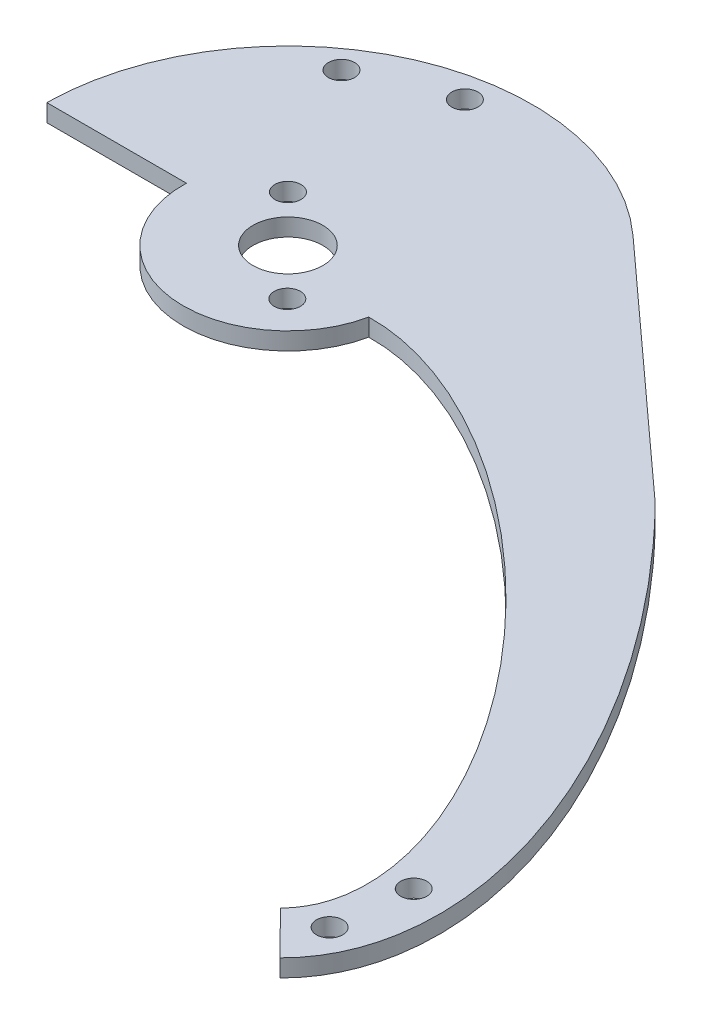
ISO-10303-21;
HEADER;
FILE_DESCRIPTION(('STEP AP214'),'2;1');
FILE_NAME('part.step','',(''),(''),'','','');
FILE_SCHEMA(('AUTOMOTIVE_DESIGN { 1 0 10303 214 1 1 1 1 }'));
ENDSEC;
DATA;
#1=APPLICATION_CONTEXT('core data for automotive mechanical design processes');
#2=APPLICATION_PROTOCOL_DEFINITION('international standard','automotive_design',2000,#1);
#3=PRODUCT_CONTEXT('',#1,'mechanical');
#4=PRODUCT('Part','Part','',(#3));
#5=PRODUCT_RELATED_PRODUCT_CATEGORY('part','',(#4));
#6=PRODUCT_DEFINITION_FORMATION('','',#4);
#7=PRODUCT_DEFINITION_CONTEXT('part definition',#1,'design');
#8=PRODUCT_DEFINITION('design','',#6,#7);
#9=PRODUCT_DEFINITION_SHAPE('','',#8);
#10=(LENGTH_UNIT() NAMED_UNIT(*) SI_UNIT(.MILLI.,.METRE.));
#11=(NAMED_UNIT(*) PLANE_ANGLE_UNIT() SI_UNIT($,.RADIAN.));
#12=(NAMED_UNIT(*) SI_UNIT($,.STERADIAN.) SOLID_ANGLE_UNIT());
#13=UNCERTAINTY_MEASURE_WITH_UNIT(LENGTH_MEASURE(1.E-05),#10,'distance_accuracy_value','');
#14=(GEOMETRIC_REPRESENTATION_CONTEXT(3) GLOBAL_UNCERTAINTY_ASSIGNED_CONTEXT((#13)) GLOBAL_UNIT_ASSIGNED_CONTEXT((#10,
#11,#12)) REPRESENTATION_CONTEXT('',''));
#15=CARTESIAN_POINT('',(0.,0.,0.));
#16=DIRECTION('',(0.,0.,1.));
#17=DIRECTION('',(1.,0.,0.));
#18=AXIS2_PLACEMENT_3D('',#15,#16,#17);
#19=CARTESIAN_POINT('',(35.1255795593791,2.,35.5836150583064));
#20=DIRECTION('',(0.,1.,0.));
#21=DIRECTION('',(0.,0.,1.));
#22=AXIS2_PLACEMENT_3D('',#19,#20,#21);
#23=PLANE('',#22);
#24=CARTESIAN_POINT('',(-14.3394109087762,2.,-20.4788011072248));
#25=DIRECTION('',(0.,1.,0.));
#26=DIRECTION('',(0.,0.,-1.));
#27=AXIS2_PLACEMENT_3D('',#24,#25,#26);
#28=CIRCLE('',#27,1.5);
#29=CARTESIAN_POINT('',(-14.3394109087762,2.,-21.9788011072248));
#30=VERTEX_POINT('',#29);
#31=EDGE_CURVE('E326',#30,#30,#28,.T.);
#32=ORIENTED_EDGE('',*,*,#31,.F.);
#33=EDGE_LOOP('',(#32));
#34=FACE_BOUND('',#33,.T.);
#35=CARTESIAN_POINT('',(71.0612718428166,2.,56.6426377168472));
#36=DIRECTION('',(0.,1.,0.));
#37=DIRECTION('',(0.,0.,1.));
#38=AXIS2_PLACEMENT_3D('',#35,#36,#37);
#39=CIRCLE('',#38,1.5);
#40=CARTESIAN_POINT('',(71.0612718428166,2.,58.1426377168472));
#41=VERTEX_POINT('',#40);
#42=EDGE_CURVE('E320',#41,#41,#39,.T.);
#43=ORIENTED_EDGE('',*,*,#42,.F.);
#44=EDGE_LOOP('',(#43));
#45=FACE_BOUND('',#44,.T.);
#46=CARTESIAN_POINT('',(70.0675780804312,2.,65.2912530273545));
#47=DIRECTION('',(0.,1.,0.));
#48=DIRECTION('',(0.,0.,1.));
#49=AXIS2_PLACEMENT_3D('',#46,#47,#48);
#50=CIRCLE('',#49,1.5);
#51=CARTESIAN_POINT('',(70.0675780804312,2.,66.7912530273545));
#52=VERTEX_POINT('',#51);
#53=EDGE_CURVE('E314',#52,#52,#50,.T.);
#54=ORIENTED_EDGE('',*,*,#53,.F.);
#55=EDGE_LOOP('',(#54));
#56=FACE_BOUND('',#55,.T.);
#57=CARTESIAN_POINT('',(-4.34120444167328,2.,-24.6201938253052));
#58=DIRECTION('',(0.,1.,0.));
#59=DIRECTION('',(0.,0.,1.));
#60=AXIS2_PLACEMENT_3D('',#57,#58,#59);
#61=CIRCLE('',#60,1.5);
#62=CARTESIAN_POINT('',(-4.34120444167328,2.,-23.1201938253052));
#63=VERTEX_POINT('',#62);
#64=EDGE_CURVE('E308',#63,#63,#61,.T.);
#65=ORIENTED_EDGE('',*,*,#64,.F.);
#66=EDGE_LOOP('',(#65));
#67=FACE_BOUND('',#66,.T.);
#68=CARTESIAN_POINT('',(-5.30330085889913,2.,-5.30330085889908));
#69=DIRECTION('',(0.,1.,0.));
#70=DIRECTION('',(0.,0.,1.));
#71=AXIS2_PLACEMENT_3D('',#68,#69,#70);
#72=CIRCLE('',#71,1.5);
#73=CARTESIAN_POINT('',(-5.30330085889913,2.,-3.80330085889908));
#74=VERTEX_POINT('',#73);
#75=EDGE_CURVE('E280',#74,#74,#72,.T.);
#76=ORIENTED_EDGE('',*,*,#75,.F.);
#77=EDGE_LOOP('',(#76));
#78=FACE_BOUND('',#77,.T.);
#79=CARTESIAN_POINT('',(35.1255795593791,2.,35.5836150583064));
#80=DIRECTION('',(0.,-1.,0.));
#81=DIRECTION('',(-0.702511591187581,0.,-0.711672301166129));
#82=AXIS2_PLACEMENT_3D('',#79,#80,#81);
#83=ELLIPSE('',#82,43.,18.);
#84=CARTESIAN_POINT('',(11.7417923440434,2.,2.47594679857322));
#85=VERTEX_POINT('',#84);
#86=CARTESIAN_POINT('',(65.3335779804451,2.,66.18552400845));
#87=VERTEX_POINT('',#86);
#88=EDGE_CURVE('E139',#85,#87,#83,.T.);
#89=ORIENTED_EDGE('',*,*,#88,.T.);
#90=DIRECTION('',(0.70251159118758,0.,0.71167230116613));
#91=VECTOR('',#90,1.);
#92=CARTESIAN_POINT('',(65.3335779804451,2.,66.18552400845));
#93=LINE('',#92,#91);
#94=CARTESIAN_POINT('',(70.2511591187582,2.,71.1672301166129));
#95=VERTEX_POINT('',#94);
#96=EDGE_CURVE('E92',#87,#95,#93,.T.);
#97=ORIENTED_EDGE('',*,*,#96,.T.);
#98=CARTESIAN_POINT('',(25.290417282753,2.,25.6202028419806));
#99=DIRECTION('',(0.,1.,0.));
#100=DIRECTION('',(0.702511591187581,0.,0.711672301166129));
#101=AXIS2_PLACEMENT_3D('',#98,#99,#100);
#102=ELLIPSE('',#101,64.,30.);
#103=CARTESIAN_POINT('',(46.6405863177367,2.,4.54485510635303));
#104=VERTEX_POINT('',#103);
#105=EDGE_CURVE('E151',#95,#104,#102,.T.);
#106=ORIENTED_EDGE('',*,*,#105,.T.);
#107=DIRECTION('',(-0.740135780708319,0.,-0.6724574530149));
#108=VECTOR('',#107,1.);
#109=CARTESIAN_POINT('',(46.6405863177367,2.,4.54485510635303));
#110=LINE('',#109,#108);
#111=CARTESIAN_POINT('',(18.8288086844172,2.,-20.7238018598329));
#112=VERTEX_POINT('',#111);
#113=EDGE_CURVE('E108',#104,#112,#110,.T.);
#114=ORIENTED_EDGE('',*,*,#113,.T.);
#115=CARTESIAN_POINT('',(0.,2.,0.));
#116=DIRECTION('',(0.,1.,0.));
#117=DIRECTION('',(0.,0.,-1.));
#118=AXIS2_PLACEMENT_3D('',#115,#116,#117);
#119=CIRCLE('',#118,28.);
#120=CARTESIAN_POINT('',(-27.9976502789953,2.,-0.362737997837232));
#121=VERTEX_POINT('',#120);
#122=EDGE_CURVE('E102',#112,#121,#119,.T.);
#123=ORIENTED_EDGE('',*,*,#122,.T.);
#124=DIRECTION('',(1.,0.,0.));
#125=VECTOR('',#124,1.);
#126=CARTESIAN_POINT('',(-11.9945162947459,2.,-0.362737997837313));
#127=LINE('',#126,#125);
#128=CARTESIAN_POINT('',(-11.9945162947459,2.,-0.362737997837313));
#129=VERTEX_POINT('',#128);
#130=EDGE_CURVE('E106',#121,#129,#127,.T.);
#131=ORIENTED_EDGE('',*,*,#130,.T.);
#132=CARTESIAN_POINT('',(0.,2.,0.));
#133=DIRECTION('',(0.,1.,0.));
#134=DIRECTION('',(0.,0.,1.));
#135=AXIS2_PLACEMENT_3D('',#132,#133,#134);
#136=CIRCLE('',#135,12.);
#137=EDGE_CURVE('E52',#129,#85,#136,.T.);
#138=ORIENTED_EDGE('',*,*,#137,.T.);
#139=EDGE_LOOP('',(#89,#97,#106,#114,#123,#131,#138));
#140=FACE_BOUND('',#139,.T.);
#141=CARTESIAN_POINT('',(0.,2.,0.));
#142=DIRECTION('',(0.,1.,0.));
#143=DIRECTION('',(0.,0.,1.));
#144=AXIS2_PLACEMENT_3D('',#141,#142,#143);
#145=CIRCLE('',#144,4.);
#146=CARTESIAN_POINT('',(0.,2.,4.));
#147=VERTEX_POINT('',#146);
#148=EDGE_CURVE('E129',#147,#147,#145,.T.);
#149=ORIENTED_EDGE('',*,*,#148,.F.);
#150=EDGE_LOOP('',(#149));
#151=FACE_BOUND('',#150,.T.);
#152=CARTESIAN_POINT('',(5.26883693390687,2.,5.33754225874595));
#153=DIRECTION('',(0.,1.,0.));
#154=DIRECTION('',(0.,0.,1.));
#155=AXIS2_PLACEMENT_3D('',#152,#153,#154);
#156=CIRCLE('',#155,1.5);
#157=CARTESIAN_POINT('',(5.26883693390687,2.,6.83754225874595));
#158=VERTEX_POINT('',#157);
#159=EDGE_CURVE('E285',#158,#158,#156,.T.);
#160=ORIENTED_EDGE('',*,*,#159,.F.);
#161=EDGE_LOOP('',(#160));
#162=FACE_BOUND('',#161,.T.);
#163=ADVANCED_FACE('F34',(#34,#45,#56,#67,#78,#140,#151,#162),#23,.T.);
#164=CARTESIAN_POINT('',(35.1255795593791,0.,35.5836150583064));
#165=DIRECTION('',(0.,1.,0.));
#166=DIRECTION('',(0.,0.,1.));
#167=AXIS2_PLACEMENT_3D('',#164,#165,#166);
#168=PLANE('',#167);
#169=CARTESIAN_POINT('',(-14.3394109087762,0.,-20.4788011072248));
#170=DIRECTION('',(0.,1.,0.));
#171=DIRECTION('',(0.,0.,-1.));
#172=AXIS2_PLACEMENT_3D('',#169,#170,#171);
#173=CIRCLE('',#172,1.5);
#174=CARTESIAN_POINT('',(-14.3394109087762,0.,-21.9788011072248));
#175=VERTEX_POINT('',#174);
#176=EDGE_CURVE('E312',#175,#175,#173,.T.);
#177=ORIENTED_EDGE('',*,*,#176,.T.);
#178=EDGE_LOOP('',(#177));
#179=FACE_BOUND('',#178,.T.);
#180=CARTESIAN_POINT('',(71.0612718428166,0.,56.6426377168472));
#181=DIRECTION('',(0.,1.,0.));
#182=DIRECTION('',(0.,0.,1.));
#183=AXIS2_PLACEMENT_3D('',#180,#181,#182);
#184=CIRCLE('',#183,1.5);
#185=CARTESIAN_POINT('',(71.0612718428166,0.,58.1426377168472));
#186=VERTEX_POINT('',#185);
#187=EDGE_CURVE('E323',#186,#186,#184,.T.);
#188=ORIENTED_EDGE('',*,*,#187,.T.);
#189=EDGE_LOOP('',(#188));
#190=FACE_BOUND('',#189,.T.);
#191=CARTESIAN_POINT('',(70.0675780804312,0.,65.2912530273545));
#192=DIRECTION('',(0.,1.,0.));
#193=DIRECTION('',(0.,0.,1.));
#194=AXIS2_PLACEMENT_3D('',#191,#192,#193);
#195=CIRCLE('',#194,1.5);
#196=CARTESIAN_POINT('',(70.0675780804312,0.,66.7912530273545));
#197=VERTEX_POINT('',#196);
#198=EDGE_CURVE('E317',#197,#197,#195,.T.);
#199=ORIENTED_EDGE('',*,*,#198,.T.);
#200=EDGE_LOOP('',(#199));
#201=FACE_BOUND('',#200,.T.);
#202=CARTESIAN_POINT('',(-4.34120444167328,0.,-24.6201938253052));
#203=DIRECTION('',(0.,1.,0.));
#204=DIRECTION('',(0.,0.,1.));
#205=AXIS2_PLACEMENT_3D('',#202,#203,#204);
#206=CIRCLE('',#205,1.5);
#207=CARTESIAN_POINT('',(-4.34120444167328,0.,-23.1201938253052));
#208=VERTEX_POINT('',#207);
#209=EDGE_CURVE('E306',#208,#208,#206,.T.);
#210=ORIENTED_EDGE('',*,*,#209,.T.);
#211=EDGE_LOOP('',(#210));
#212=FACE_BOUND('',#211,.T.);
#213=CARTESIAN_POINT('',(35.1255795593791,0.,35.5836150583064));
#214=DIRECTION('',(0.,-1.,0.));
#215=DIRECTION('',(-0.702511591187581,0.,-0.711672301166129));
#216=AXIS2_PLACEMENT_3D('',#213,#214,#215);
#217=ELLIPSE('',#216,43.,18.);
#218=CARTESIAN_POINT('',(11.7417923440434,0.,2.47594679857322));
#219=VERTEX_POINT('',#218);
#220=CARTESIAN_POINT('',(65.3335779804451,0.,66.18552400845));
#221=VERTEX_POINT('',#220);
#222=EDGE_CURVE('E125',#219,#221,#217,.T.);
#223=ORIENTED_EDGE('',*,*,#222,.F.);
#224=CARTESIAN_POINT('',(0.,0.,0.));
#225=DIRECTION('',(0.,1.,0.));
#226=DIRECTION('',(0.,0.,1.));
#227=AXIS2_PLACEMENT_3D('',#224,#225,#226);
#228=CIRCLE('',#227,12.);
#229=CARTESIAN_POINT('',(-11.9945162947459,0.,-0.362737997837313));
#230=VERTEX_POINT('',#229);
#231=EDGE_CURVE('E84',#230,#219,#228,.T.);
#232=ORIENTED_EDGE('',*,*,#231,.F.);
#233=DIRECTION('',(1.,0.,0.));
#234=VECTOR('',#233,1.);
#235=CARTESIAN_POINT('',(-11.9945162947459,0.,-0.362737997837313));
#236=LINE('',#235,#234);
#237=CARTESIAN_POINT('',(-27.9976502789953,0.,-0.362737997837232));
#238=VERTEX_POINT('',#237);
#239=EDGE_CURVE('E78',#238,#230,#236,.T.);
#240=ORIENTED_EDGE('',*,*,#239,.F.);
#241=CARTESIAN_POINT('',(0.,0.,0.));
#242=DIRECTION('',(0.,1.,0.));
#243=DIRECTION('',(0.,0.,1.));
#244=AXIS2_PLACEMENT_3D('',#241,#242,#243);
#245=CIRCLE('',#244,28.);
#246=CARTESIAN_POINT('',(18.8288086844172,0.,-20.7238018598329));
#247=VERTEX_POINT('',#246);
#248=EDGE_CURVE('E115',#247,#238,#245,.T.);
#249=ORIENTED_EDGE('',*,*,#248,.F.);
#250=DIRECTION('',(-0.740135780708319,0.,-0.6724574530149));
#251=VECTOR('',#250,1.);
#252=CARTESIAN_POINT('',(46.6405863177367,0.,4.54485510635303));
#253=LINE('',#252,#251);
#254=CARTESIAN_POINT('',(46.6405863177367,0.,4.54485510635303));
#255=VERTEX_POINT('',#254);
#256=EDGE_CURVE('E133',#255,#247,#253,.T.);
#257=ORIENTED_EDGE('',*,*,#256,.F.);
#258=CARTESIAN_POINT('',(25.290417282753,0.,25.6202028419806));
#259=DIRECTION('',(0.,1.,0.));
#260=DIRECTION('',(0.702511591187581,0.,0.711672301166129));
#261=AXIS2_PLACEMENT_3D('',#258,#259,#260);
#262=ELLIPSE('',#261,64.,30.);
#263=CARTESIAN_POINT('',(70.2511591187582,0.,71.1672301166129));
#264=VERTEX_POINT('',#263);
#265=EDGE_CURVE('E131',#264,#255,#262,.T.);
#266=ORIENTED_EDGE('',*,*,#265,.F.);
#267=DIRECTION('',(0.70251159118758,0.,0.71167230116613));
#268=VECTOR('',#267,1.);
#269=CARTESIAN_POINT('',(65.3335779804451,0.,66.18552400845));
#270=LINE('',#269,#268);
#271=EDGE_CURVE('E128',#221,#264,#270,.T.);
#272=ORIENTED_EDGE('',*,*,#271,.F.);
#273=EDGE_LOOP('',(#223,#232,#240,#249,#257,#266,#272));
#274=FACE_BOUND('',#273,.T.);
#275=CARTESIAN_POINT('',(0.,0.,0.));
#276=DIRECTION('',(0.,1.,0.));
#277=DIRECTION('',(0.,0.,1.));
#278=AXIS2_PLACEMENT_3D('',#275,#276,#277);
#279=CIRCLE('',#278,4.);
#280=CARTESIAN_POINT('',(0.,0.,4.));
#281=VERTEX_POINT('',#280);
#282=EDGE_CURVE('E287',#281,#281,#279,.T.);
#283=ORIENTED_EDGE('',*,*,#282,.T.);
#284=EDGE_LOOP('',(#283));
#285=FACE_BOUND('',#284,.T.);
#286=CARTESIAN_POINT('',(-5.30330085889913,0.,-5.30330085889908));
#287=DIRECTION('',(0.,1.,0.));
#288=DIRECTION('',(0.,0.,1.));
#289=AXIS2_PLACEMENT_3D('',#286,#287,#288);
#290=CIRCLE('',#289,1.5);
#291=CARTESIAN_POINT('',(-5.30330085889913,0.,-3.80330085889908));
#292=VERTEX_POINT('',#291);
#293=EDGE_CURVE('E283',#292,#292,#290,.T.);
#294=ORIENTED_EDGE('',*,*,#293,.T.);
#295=EDGE_LOOP('',(#294));
#296=FACE_BOUND('',#295,.T.);
#297=CARTESIAN_POINT('',(5.26883693390687,0.,5.33754225874595));
#298=DIRECTION('',(0.,1.,0.));
#299=DIRECTION('',(0.,0.,1.));
#300=AXIS2_PLACEMENT_3D('',#297,#298,#299);
#301=CIRCLE('',#300,1.5);
#302=CARTESIAN_POINT('',(5.26883693390687,0.,6.83754225874595));
#303=VERTEX_POINT('',#302);
#304=EDGE_CURVE('E290',#303,#303,#301,.T.);
#305=ORIENTED_EDGE('',*,*,#304,.T.);
#306=EDGE_LOOP('',(#305));
#307=FACE_BOUND('',#306,.T.);
#308=ADVANCED_FACE('F155',(#179,#190,#201,#212,#274,#285,#296,#307),#168,.F.);
#309=DIRECTION('',(0.,-1.,0.));
#310=VECTOR('',#309,1.);
#311=SURFACE_OF_LINEAR_EXTRUSION('',#83,#310);
#312=ORIENTED_EDGE('',*,*,#222,.T.);
#313=DIRECTION('',(0.,-1.,0.));
#314=VECTOR('',#313,1.);
#315=CARTESIAN_POINT('',(65.3335779804451,2.,66.18552400845));
#316=LINE('',#315,#314);
#317=EDGE_CURVE('E11',#87,#221,#316,.T.);
#318=ORIENTED_EDGE('',*,*,#317,.F.);
#319=ORIENTED_EDGE('',*,*,#88,.F.);
#320=DIRECTION('',(0.,-1.,0.));
#321=VECTOR('',#320,1.);
#322=CARTESIAN_POINT('',(11.7417923440434,2.,2.47594679857322));
#323=LINE('',#322,#321);
#324=EDGE_CURVE('E121',#85,#219,#323,.T.);
#325=ORIENTED_EDGE('',*,*,#324,.T.);
#326=EDGE_LOOP('',(#312,#318,#319,#325));
#327=FACE_BOUND('',#326,.T.);
#328=ADVANCED_FACE('F36',(#327),#311,.F.);
#329=CARTESIAN_POINT('',(65.3335779804451,2.,66.18552400845));
#330=DIRECTION('',(0.71167230116613,0.,-0.70251159118758));
#331=DIRECTION('',(-0.70251159118758,0.,-0.71167230116613));
#332=AXIS2_PLACEMENT_3D('',#329,#330,#331);
#333=PLANE('',#332);
#334=ORIENTED_EDGE('',*,*,#271,.T.);
#335=DIRECTION('',(0.,-1.,0.));
#336=VECTOR('',#335,1.);
#337=CARTESIAN_POINT('',(70.2511591187582,2.,71.1672301166129));
#338=LINE('',#337,#336);
#339=EDGE_CURVE('E44',#95,#264,#338,.T.);
#340=ORIENTED_EDGE('',*,*,#339,.F.);
#341=ORIENTED_EDGE('',*,*,#96,.F.);
#342=ORIENTED_EDGE('',*,*,#317,.T.);
#343=EDGE_LOOP('',(#334,#340,#341,#342));
#344=FACE_BOUND('',#343,.T.);
#345=ADVANCED_FACE('F165',(#344),#333,.F.);
#346=DIRECTION('',(0.,-1.,0.));
#347=VECTOR('',#346,1.);
#348=SURFACE_OF_LINEAR_EXTRUSION('',#102,#347);
#349=ORIENTED_EDGE('',*,*,#265,.T.);
#350=DIRECTION('',(0.,-1.,0.));
#351=VECTOR('',#350,1.);
#352=CARTESIAN_POINT('',(46.6405863177367,2.,4.54485510635303));
#353=LINE('',#352,#351);
#354=EDGE_CURVE('E143',#104,#255,#353,.T.);
#355=ORIENTED_EDGE('',*,*,#354,.F.);
#356=ORIENTED_EDGE('',*,*,#105,.F.);
#357=ORIENTED_EDGE('',*,*,#339,.T.);
#358=EDGE_LOOP('',(#349,#355,#356,#357));
#359=FACE_BOUND('',#358,.T.);
#360=ADVANCED_FACE('F149',(#359),#348,.F.);
#361=CARTESIAN_POINT('',(46.6405863177367,2.,4.54485510635303));
#362=DIRECTION('',(-0.6724574530149,0.,0.740135780708319));
#363=DIRECTION('',(0.740135780708319,0.,0.6724574530149));
#364=AXIS2_PLACEMENT_3D('',#361,#362,#363);
#365=PLANE('',#364);
#366=ORIENTED_EDGE('',*,*,#256,.T.);
#367=DIRECTION('',(0.,-1.,0.));
#368=VECTOR('',#367,1.);
#369=CARTESIAN_POINT('',(18.8288086844172,2.,-20.7238018598329));
#370=LINE('',#369,#368);
#371=EDGE_CURVE('E116',#112,#247,#370,.T.);
#372=ORIENTED_EDGE('',*,*,#371,.F.);
#373=ORIENTED_EDGE('',*,*,#113,.F.);
#374=ORIENTED_EDGE('',*,*,#354,.T.);
#375=EDGE_LOOP('',(#366,#372,#373,#374));
#376=FACE_BOUND('',#375,.T.);
#377=ADVANCED_FACE('F158',(#376),#365,.F.);
#378=CARTESIAN_POINT('',(0.,2.,0.));
#379=DIRECTION('',(0.,-1.,0.));
#380=DIRECTION('',(0.,0.,-1.));
#381=AXIS2_PLACEMENT_3D('',#378,#379,#380);
#382=CYLINDRICAL_SURFACE('',#381,28.);
#383=ORIENTED_EDGE('',*,*,#248,.T.);
#384=DIRECTION('',(0.,-1.,0.));
#385=VECTOR('',#384,1.);
#386=CARTESIAN_POINT('',(-27.9976502789953,2.,-0.362737997837232));
#387=LINE('',#386,#385);
#388=EDGE_CURVE('E113',#121,#238,#387,.T.);
#389=ORIENTED_EDGE('',*,*,#388,.F.);
#390=ORIENTED_EDGE('',*,*,#122,.F.);
#391=ORIENTED_EDGE('',*,*,#371,.T.);
#392=EDGE_LOOP('',(#383,#389,#390,#391));
#393=FACE_BOUND('',#392,.T.);
#394=ADVANCED_FACE('F114',(#393),#382,.T.);
#395=CARTESIAN_POINT('',(-11.9945162947459,2.,-0.362737997837313));
#396=DIRECTION('',(0.,0.,-1.));
#397=DIRECTION('',(-1.,0.,0.));
#398=AXIS2_PLACEMENT_3D('',#395,#396,#397);
#399=PLANE('',#398);
#400=ORIENTED_EDGE('',*,*,#239,.T.);
#401=DIRECTION('',(0.,-1.,0.));
#402=VECTOR('',#401,1.);
#403=CARTESIAN_POINT('',(-11.9945162947459,2.,-0.362737997837313));
#404=LINE('',#403,#402);
#405=EDGE_CURVE('E117',#129,#230,#404,.T.);
#406=ORIENTED_EDGE('',*,*,#405,.F.);
#407=ORIENTED_EDGE('',*,*,#130,.F.);
#408=ORIENTED_EDGE('',*,*,#388,.T.);
#409=EDGE_LOOP('',(#400,#406,#407,#408));
#410=FACE_BOUND('',#409,.T.);
#411=ADVANCED_FACE('F119',(#410),#399,.F.);
#412=CARTESIAN_POINT('',(0.,2.,0.));
#413=DIRECTION('',(0.,-1.,0.));
#414=DIRECTION('',(0.,0.,-1.));
#415=AXIS2_PLACEMENT_3D('',#412,#413,#414);
#416=CYLINDRICAL_SURFACE('',#415,12.);
#417=ORIENTED_EDGE('',*,*,#231,.T.);
#418=ORIENTED_EDGE('',*,*,#324,.F.);
#419=ORIENTED_EDGE('',*,*,#137,.F.);
#420=ORIENTED_EDGE('',*,*,#405,.T.);
#421=EDGE_LOOP('',(#417,#418,#419,#420));
#422=FACE_BOUND('',#421,.T.);
#423=ADVANCED_FACE('F186',(#422),#416,.T.);
#424=CARTESIAN_POINT('',(0.,2.,0.));
#425=DIRECTION('',(0.,-1.,0.));
#426=DIRECTION('',(0.,0.,-1.));
#427=AXIS2_PLACEMENT_3D('',#424,#425,#426);
#428=CYLINDRICAL_SURFACE('',#427,4.);
#429=ORIENTED_EDGE('',*,*,#148,.T.);
#430=EDGE_LOOP('',(#429));
#431=FACE_BOUND('',#430,.T.);
#432=ORIENTED_EDGE('',*,*,#282,.F.);
#433=EDGE_LOOP('',(#432));
#434=FACE_BOUND('',#433,.T.);
#435=ADVANCED_FACE('F183',(#431,#434),#428,.F.);
#436=CARTESIAN_POINT('',(-5.30330085889913,2.,-5.30330085889908));
#437=DIRECTION('',(0.,-1.,0.));
#438=DIRECTION('',(0.,0.,-1.));
#439=AXIS2_PLACEMENT_3D('',#436,#437,#438);
#440=CYLINDRICAL_SURFACE('',#439,1.5);
#441=ORIENTED_EDGE('',*,*,#75,.T.);
#442=EDGE_LOOP('',(#441));
#443=FACE_BOUND('',#442,.T.);
#444=ORIENTED_EDGE('',*,*,#293,.F.);
#445=EDGE_LOOP('',(#444));
#446=FACE_BOUND('',#445,.T.);
#447=ADVANCED_FACE('F269',(#443,#446),#440,.F.);
#448=CARTESIAN_POINT('',(5.26883693390687,2.,5.33754225874595));
#449=DIRECTION('',(0.,-1.,0.));
#450=DIRECTION('',(0.,0.,-1.));
#451=AXIS2_PLACEMENT_3D('',#448,#449,#450);
#452=CYLINDRICAL_SURFACE('',#451,1.5);
#453=ORIENTED_EDGE('',*,*,#159,.T.);
#454=EDGE_LOOP('',(#453));
#455=FACE_BOUND('',#454,.T.);
#456=ORIENTED_EDGE('',*,*,#304,.F.);
#457=EDGE_LOOP('',(#456));
#458=FACE_BOUND('',#457,.T.);
#459=ADVANCED_FACE('F230',(#455,#458),#452,.F.);
#460=CARTESIAN_POINT('',(-4.34120444167328,0.,-24.6201938253052));
#461=DIRECTION('',(0.,1.,0.));
#462=DIRECTION('',(0.,0.,1.));
#463=AXIS2_PLACEMENT_3D('',#460,#461,#462);
#464=CYLINDRICAL_SURFACE('',#463,1.5);
#465=ORIENTED_EDGE('',*,*,#209,.F.);
#466=EDGE_LOOP('',(#465));
#467=FACE_BOUND('',#466,.T.);
#468=ORIENTED_EDGE('',*,*,#64,.T.);
#469=EDGE_LOOP('',(#468));
#470=FACE_BOUND('',#469,.T.);
#471=ADVANCED_FACE('F224',(#467,#470),#464,.F.);
#472=CARTESIAN_POINT('',(70.0675780804312,0.,65.2912530273545));
#473=DIRECTION('',(0.,1.,0.));
#474=DIRECTION('',(0.,0.,1.));
#475=AXIS2_PLACEMENT_3D('',#472,#473,#474);
#476=CYLINDRICAL_SURFACE('',#475,1.5);
#477=ORIENTED_EDGE('',*,*,#198,.F.);
#478=EDGE_LOOP('',(#477));
#479=FACE_BOUND('',#478,.T.);
#480=ORIENTED_EDGE('',*,*,#53,.T.);
#481=EDGE_LOOP('',(#480));
#482=FACE_BOUND('',#481,.T.);
#483=ADVANCED_FACE('F229',(#479,#482),#476,.F.);
#484=CARTESIAN_POINT('',(71.0612718428166,0.,56.6426377168472));
#485=DIRECTION('',(0.,1.,0.));
#486=DIRECTION('',(0.,0.,1.));
#487=AXIS2_PLACEMENT_3D('',#484,#485,#486);
#488=CYLINDRICAL_SURFACE('',#487,1.5);
#489=ORIENTED_EDGE('',*,*,#187,.F.);
#490=EDGE_LOOP('',(#489));
#491=FACE_BOUND('',#490,.T.);
#492=ORIENTED_EDGE('',*,*,#42,.T.);
#493=EDGE_LOOP('',(#492));
#494=FACE_BOUND('',#493,.T.);
#495=ADVANCED_FACE('F242',(#491,#494),#488,.F.);
#496=CARTESIAN_POINT('',(-14.3394109087762,0.,-20.4788011072248));
#497=DIRECTION('',(0.,1.,0.));
#498=DIRECTION('',(0.,0.,1.));
#499=AXIS2_PLACEMENT_3D('',#496,#497,#498);
#500=CYLINDRICAL_SURFACE('',#499,1.5);
#501=ORIENTED_EDGE('',*,*,#176,.F.);
#502=EDGE_LOOP('',(#501));
#503=FACE_BOUND('',#502,.T.);
#504=ORIENTED_EDGE('',*,*,#31,.T.);
#505=EDGE_LOOP('',(#504));
#506=FACE_BOUND('',#505,.T.);
#507=ADVANCED_FACE('F252',(#503,#506),#500,.F.);
#508=CLOSED_SHELL('',(#163,#308,#328,#345,#360,#377,#394,#411,#423,#435,#447,#459,#471,#483,
#495,#507));
#509=MANIFOLD_SOLID_BREP('B2',#508);
#510=ADVANCED_BREP_SHAPE_REPRESENTATION('',(#18,#509),#14);
#511=SHAPE_DEFINITION_REPRESENTATION(#9,#510);
ENDSEC;
END-ISO-10303-21;
